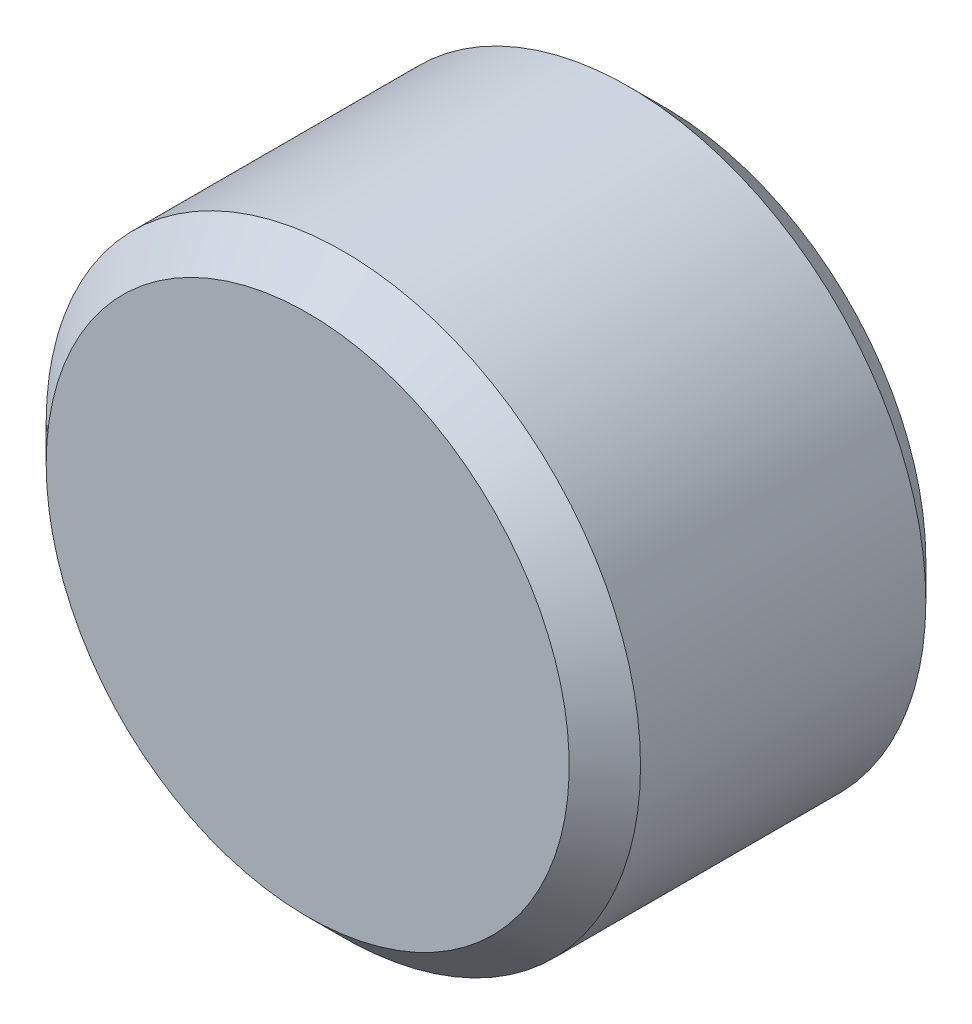
ISO-10303-21;
HEADER;
FILE_DESCRIPTION(('STEP AP214'),'2;1');
FILE_NAME('part.step','',(''),(''),'','','');
FILE_SCHEMA(('AUTOMOTIVE_DESIGN { 1 0 10303 214 1 1 1 1 }'));
ENDSEC;
DATA;
#1=APPLICATION_CONTEXT('core data for automotive mechanical design processes');
#2=APPLICATION_PROTOCOL_DEFINITION('international standard','automotive_design',2000,#1);
#3=PRODUCT_CONTEXT('',#1,'mechanical');
#4=PRODUCT('Part','Part','',(#3));
#5=PRODUCT_RELATED_PRODUCT_CATEGORY('part','',(#4));
#6=PRODUCT_DEFINITION_FORMATION('','',#4);
#7=PRODUCT_DEFINITION_CONTEXT('part definition',#1,'design');
#8=PRODUCT_DEFINITION('design','',#6,#7);
#9=PRODUCT_DEFINITION_SHAPE('','',#8);
#10=(LENGTH_UNIT() NAMED_UNIT(*) SI_UNIT(.MILLI.,.METRE.));
#11=(NAMED_UNIT(*) PLANE_ANGLE_UNIT() SI_UNIT($,.RADIAN.));
#12=(NAMED_UNIT(*) SI_UNIT($,.STERADIAN.) SOLID_ANGLE_UNIT());
#13=UNCERTAINTY_MEASURE_WITH_UNIT(LENGTH_MEASURE(1.E-05),#10,'distance_accuracy_value','');
#14=(GEOMETRIC_REPRESENTATION_CONTEXT(3) GLOBAL_UNCERTAINTY_ASSIGNED_CONTEXT((#13)) GLOBAL_UNIT_ASSIGNED_CONTEXT((#10,
#11,#12)) REPRESENTATION_CONTEXT('',''));
#15=CARTESIAN_POINT('',(0.,0.,0.));
#16=DIRECTION('',(0.,0.,1.));
#17=DIRECTION('',(1.,0.,0.));
#18=AXIS2_PLACEMENT_3D('',#15,#16,#17);
#19=CARTESIAN_POINT('',(0.,0.,3.));
#20=DIRECTION('',(0.,0.,-1.));
#21=DIRECTION('',(-1.,0.,0.));
#22=AXIS2_PLACEMENT_3D('',#19,#20,#21);
#23=CYLINDRICAL_SURFACE('',#22,2.5);
#24=CARTESIAN_POINT('',(0.,0.,2.7));
#25=DIRECTION('',(0.,0.,1.));
#26=DIRECTION('',(1.,0.,0.));
#27=AXIS2_PLACEMENT_3D('',#24,#25,#26);
#28=CIRCLE('',#27,2.5);
#29=CARTESIAN_POINT('',(-2.5,0.,2.7));
#30=VERTEX_POINT('',#29);
#31=EDGE_CURVE('E38',#30,#30,#28,.F.);
#32=ORIENTED_EDGE('',*,*,#31,.T.);
#33=EDGE_LOOP('',(#32));
#34=FACE_BOUND('',#33,.T.);
#35=CARTESIAN_POINT('',(0.,0.,0.300000000000001));
#36=DIRECTION('',(0.,0.,1.));
#37=DIRECTION('',(1.,0.,0.));
#38=AXIS2_PLACEMENT_3D('',#35,#36,#37);
#39=CIRCLE('',#38,2.5);
#40=CARTESIAN_POINT('',(2.5,0.,0.300000000000001));
#41=VERTEX_POINT('',#40);
#42=EDGE_CURVE('E42',#41,#41,#39,.T.);
#43=ORIENTED_EDGE('',*,*,#42,.T.);
#44=EDGE_LOOP('',(#43));
#45=FACE_BOUND('',#44,.T.);
#46=ADVANCED_FACE('F31',(#34,#45),#23,.T.);
#47=CARTESIAN_POINT('',(0.,0.,3.));
#48=DIRECTION('',(0.,0.,1.));
#49=DIRECTION('',(1.,0.,0.));
#50=AXIS2_PLACEMENT_3D('',#47,#48,#49);
#51=PLANE('',#50);
#52=CARTESIAN_POINT('',(0.,0.,3.));
#53=DIRECTION('',(0.,0.,1.));
#54=DIRECTION('',(1.,0.,0.));
#55=AXIS2_PLACEMENT_3D('',#52,#53,#54);
#56=CIRCLE('',#55,2.2);
#57=CARTESIAN_POINT('',(-2.2,0.,3.));
#58=VERTEX_POINT('',#57);
#59=EDGE_CURVE('E46',#58,#58,#56,.T.);
#60=ORIENTED_EDGE('',*,*,#59,.T.);
#61=EDGE_LOOP('',(#60));
#62=FACE_BOUND('',#61,.T.);
#63=ADVANCED_FACE('F52',(#62),#51,.T.);
#64=CARTESIAN_POINT('',(0.,0.,0.));
#65=DIRECTION('',(0.,0.,1.));
#66=DIRECTION('',(1.,0.,0.));
#67=AXIS2_PLACEMENT_3D('',#64,#65,#66);
#68=PLANE('',#67);
#69=CARTESIAN_POINT('',(0.,0.,0.));
#70=DIRECTION('',(0.,0.,1.));
#71=DIRECTION('',(1.,0.,0.));
#72=AXIS2_PLACEMENT_3D('',#69,#70,#71);
#73=CIRCLE('',#72,2.2);
#74=CARTESIAN_POINT('',(2.2,0.,0.));
#75=VERTEX_POINT('',#74);
#76=EDGE_CURVE('E10',#75,#75,#73,.F.);
#77=ORIENTED_EDGE('',*,*,#76,.T.);
#78=EDGE_LOOP('',(#77));
#79=FACE_BOUND('',#78,.T.);
#80=ADVANCED_FACE('F56',(#79),#68,.F.);
#81=CARTESIAN_POINT('',(0.,0.,3.));
#82=DIRECTION('',(0.,0.,-1.));
#83=DIRECTION('',(-1.,0.,0.));
#84=AXIS2_PLACEMENT_3D('',#81,#82,#83);
#85=CONICAL_SURFACE('',#84,2.2,0.785398163397448);
#86=CARTESIAN_POINT('',(-2.5,0.,2.7));
#87=CARTESIAN_POINT('',(-2.496875,0.,2.703125));
#88=CARTESIAN_POINT('',(-2.49375,0.,2.70625));
#89=CARTESIAN_POINT('',(-2.4875,0.,2.7125));
#90=CARTESIAN_POINT('',(-2.484375,0.,2.715625));
#91=CARTESIAN_POINT('',(-2.478125,0.,2.721875));
#92=CARTESIAN_POINT('',(-2.475,0.,2.725));
#93=CARTESIAN_POINT('',(-2.46875,0.,2.73125));
#94=CARTESIAN_POINT('',(-2.465625,0.,2.734375));
#95=CARTESIAN_POINT('',(-2.459375,0.,2.740625));
#96=CARTESIAN_POINT('',(-2.45625,0.,2.74375));
#97=CARTESIAN_POINT('',(-2.45,0.,2.75));
#98=CARTESIAN_POINT('',(-2.446875,0.,2.753125));
#99=CARTESIAN_POINT('',(-2.440625,0.,2.759375));
#100=CARTESIAN_POINT('',(-2.4375,0.,2.7625));
#101=CARTESIAN_POINT('',(-2.43125,0.,2.76875));
#102=CARTESIAN_POINT('',(-2.428125,0.,2.771875));
#103=CARTESIAN_POINT('',(-2.421875,0.,2.778125));
#104=CARTESIAN_POINT('',(-2.41875,0.,2.78125));
#105=CARTESIAN_POINT('',(-2.4125,0.,2.7875));
#106=CARTESIAN_POINT('',(-2.409375,0.,2.790625));
#107=CARTESIAN_POINT('',(-2.403125,0.,2.796875));
#108=CARTESIAN_POINT('',(-2.4,0.,2.8));
#109=CARTESIAN_POINT('',(-2.39375,0.,2.80625));
#110=CARTESIAN_POINT('',(-2.390625,0.,2.809375));
#111=CARTESIAN_POINT('',(-2.384375,0.,2.815625));
#112=CARTESIAN_POINT('',(-2.38125,0.,2.81875));
#113=CARTESIAN_POINT('',(-2.375,0.,2.825));
#114=CARTESIAN_POINT('',(-2.371875,0.,2.828125));
#115=CARTESIAN_POINT('',(-2.365625,0.,2.834375));
#116=CARTESIAN_POINT('',(-2.3625,0.,2.8375));
#117=CARTESIAN_POINT('',(-2.35625,0.,2.84375));
#118=CARTESIAN_POINT('',(-2.353125,0.,2.846875));
#119=CARTESIAN_POINT('',(-2.346875,0.,2.853125));
#120=CARTESIAN_POINT('',(-2.34375,0.,2.85625));
#121=CARTESIAN_POINT('',(-2.3375,0.,2.8625));
#122=CARTESIAN_POINT('',(-2.334375,0.,2.865625));
#123=CARTESIAN_POINT('',(-2.328125,0.,2.871875));
#124=CARTESIAN_POINT('',(-2.325,0.,2.875));
#125=CARTESIAN_POINT('',(-2.31875,0.,2.88125));
#126=CARTESIAN_POINT('',(-2.315625,0.,2.884375));
#127=CARTESIAN_POINT('',(-2.309375,0.,2.890625));
#128=CARTESIAN_POINT('',(-2.30625,0.,2.89375));
#129=CARTESIAN_POINT('',(-2.3,0.,2.9));
#130=CARTESIAN_POINT('',(-2.296875,0.,2.903125));
#131=CARTESIAN_POINT('',(-2.290625,0.,2.909375));
#132=CARTESIAN_POINT('',(-2.2875,0.,2.9125));
#133=CARTESIAN_POINT('',(-2.28125,0.,2.91875));
#134=CARTESIAN_POINT('',(-2.278125,0.,2.921875));
#135=CARTESIAN_POINT('',(-2.271875,0.,2.928125));
#136=CARTESIAN_POINT('',(-2.26875,0.,2.93125));
#137=CARTESIAN_POINT('',(-2.2625,0.,2.9375));
#138=CARTESIAN_POINT('',(-2.259375,0.,2.940625));
#139=CARTESIAN_POINT('',(-2.253125,0.,2.946875));
#140=CARTESIAN_POINT('',(-2.25,0.,2.95));
#141=CARTESIAN_POINT('',(-2.24375,0.,2.95625));
#142=CARTESIAN_POINT('',(-2.240625,0.,2.959375));
#143=CARTESIAN_POINT('',(-2.234375,0.,2.965625));
#144=CARTESIAN_POINT('',(-2.23125,0.,2.96875));
#145=CARTESIAN_POINT('',(-2.225,0.,2.975));
#146=CARTESIAN_POINT('',(-2.221875,0.,2.978125));
#147=CARTESIAN_POINT('',(-2.215625,0.,2.984375));
#148=CARTESIAN_POINT('',(-2.2125,0.,2.9875));
#149=CARTESIAN_POINT('',(-2.20625,0.,2.99375));
#150=CARTESIAN_POINT('',(-2.203125,0.,2.996875));
#151=CARTESIAN_POINT('',(-2.2,0.,3.));
#152=B_SPLINE_CURVE_WITH_KNOTS('',3,(#86,#87,#88,#89,#90,#91,#92,#93,#94,#95,#96,#97,#98,#99,
#100,#101,#102,#103,#104,#105,#106,#107,#108,#109,#110,#111,#112,#113,#114,#115,#116,#117,#118,
#119,#120,#121,#122,#123,#124,#125,#126,#127,#128,#129,#130,#131,#132,#133,#134,#135,#136,#137,
#138,#139,#140,#141,#142,#143,#144,#145,#146,#147,#148,#149,#150,#151),.UNSPECIFIED.,.F.,.F.,(4,
2,2,2,2,2,2,2,2,2,2,2,2,2,2,2,2,2,2,2,2,2,2,2,2,2,2,2,2,2,2,2,4),(0.,0.0132582521472475,
0.0265165042944951,0.0397747564417429,0.0530330085889907,0.0662912607362383,0.0795495128834858,
0.0928077650307337,0.106066017177981,0.119324269325229,0.132582521472477,0.145840773619724,
0.159099025766972,0.17235727791422,0.185615530061467,0.198873782208715,0.212132034355963,
0.225390286503211,0.238648538650458,0.251906790797706,0.265165042944954,0.278423295092201,
0.291681547239449,0.304939799386697,0.318198051533944,0.331456303681192,0.34471455582844,
0.357972807975687,0.371231060122935,0.384489312270183,0.39774756441743,0.411005816564678,
0.424264068711926),.UNSPECIFIED.);
#153=EDGE_CURVE('BSEAM54',#30,#58,#152,.T.);
#154=ORIENTED_EDGE('',*,*,#31,.F.);
#155=ORIENTED_EDGE('',*,*,#59,.F.);
#156=ORIENTED_EDGE('',*,*,#153,.T.);
#157=ORIENTED_EDGE('',*,*,#153,.F.);
#158=EDGE_LOOP('',(#154,#156,#155,#157));
#159=FACE_BOUND('',#158,.T.);
#160=ADVANCED_FACE('F54',(#159),#85,.T.);
#161=CARTESIAN_POINT('',(0.,0.,0.300000000000001));
#162=DIRECTION('',(0.,0.,1.));
#163=DIRECTION('',(1.,0.,0.));
#164=AXIS2_PLACEMENT_3D('',#161,#162,#163);
#165=CONICAL_SURFACE('',#164,2.5,0.785398163397451);
#166=ORIENTED_EDGE('',*,*,#76,.F.);
#167=EDGE_LOOP('',(#166));
#168=FACE_BOUND('',#167,.T.);
#169=ORIENTED_EDGE('',*,*,#42,.F.);
#170=EDGE_LOOP('',(#169));
#171=FACE_BOUND('',#170,.T.);
#172=ADVANCED_FACE('F33',(#168,#171),#165,.T.);
#173=CLOSED_SHELL('',(#46,#63,#80,#160,#172));
#174=MANIFOLD_SOLID_BREP('B2',#173);
#175=ADVANCED_BREP_SHAPE_REPRESENTATION('',(#18,#174),#14);
#176=SHAPE_DEFINITION_REPRESENTATION(#9,#175);
ENDSEC;
END-ISO-10303-21;
